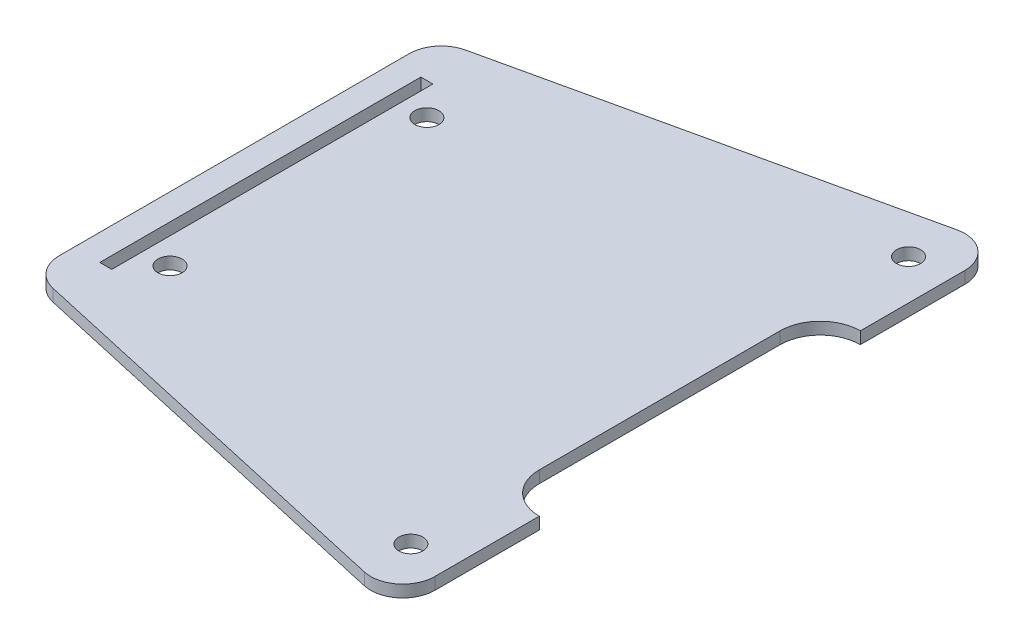
ISO-10303-21;
HEADER;
FILE_DESCRIPTION(('STEP AP214'),'2;1');
FILE_NAME('part.step','',(''),(''),'','','');
FILE_SCHEMA(('AUTOMOTIVE_DESIGN { 1 0 10303 214 1 1 1 1 }'));
ENDSEC;
DATA;
#1=APPLICATION_CONTEXT('core data for automotive mechanical design processes');
#2=APPLICATION_PROTOCOL_DEFINITION('international standard','automotive_design',2000,#1);
#3=PRODUCT_CONTEXT('',#1,'mechanical');
#4=PRODUCT('Part','Part','',(#3));
#5=PRODUCT_RELATED_PRODUCT_CATEGORY('part','',(#4));
#6=PRODUCT_DEFINITION_FORMATION('','',#4);
#7=PRODUCT_DEFINITION_CONTEXT('part definition',#1,'design');
#8=PRODUCT_DEFINITION('design','',#6,#7);
#9=PRODUCT_DEFINITION_SHAPE('','',#8);
#10=(LENGTH_UNIT() NAMED_UNIT(*) SI_UNIT(.MILLI.,.METRE.));
#11=(NAMED_UNIT(*) PLANE_ANGLE_UNIT() SI_UNIT($,.RADIAN.));
#12=(NAMED_UNIT(*) SI_UNIT($,.STERADIAN.) SOLID_ANGLE_UNIT());
#13=UNCERTAINTY_MEASURE_WITH_UNIT(LENGTH_MEASURE(1.E-05),#10,'distance_accuracy_value','');
#14=(GEOMETRIC_REPRESENTATION_CONTEXT(3) GLOBAL_UNCERTAINTY_ASSIGNED_CONTEXT((#13)) GLOBAL_UNIT_ASSIGNED_CONTEXT((#10,
#11,#12)) REPRESENTATION_CONTEXT('',''));
#15=CARTESIAN_POINT('',(0.,0.,0.));
#16=DIRECTION('',(0.,0.,1.));
#17=DIRECTION('',(1.,0.,0.));
#18=AXIS2_PLACEMENT_3D('',#15,#16,#17);
#19=CARTESIAN_POINT('',(25.,1.5,-38.));
#20=DIRECTION('',(-1.,0.,0.));
#21=DIRECTION('',(0.,0.,1.));
#22=AXIS2_PLACEMENT_3D('',#19,#20,#21);
#23=PLANE('',#22);
#24=DIRECTION('',(0.,0.,-1.));
#25=VECTOR('',#24,1.);
#26=CARTESIAN_POINT('',(25.,1.5,-38.));
#27=LINE('',#26,#25);
#28=CARTESIAN_POINT('',(25.,1.5,33.00420383401));
#29=VERTEX_POINT('',#28);
#30=CARTESIAN_POINT('',(25.,1.5,20.));
#31=VERTEX_POINT('',#30);
#32=EDGE_CURVE('E253',#29,#31,#27,.T.);
#33=ORIENTED_EDGE('',*,*,#32,.F.);
#34=DIRECTION('',(0.,-1.,0.));
#35=VECTOR('',#34,1.);
#36=CARTESIAN_POINT('',(25.,1.5,33.00420383401));
#37=LINE('',#36,#35);
#38=CARTESIAN_POINT('',(25.,0.,33.00420383401));
#39=VERTEX_POINT('',#38);
#40=EDGE_CURVE('E293',#29,#39,#37,.T.);
#41=ORIENTED_EDGE('',*,*,#40,.T.);
#42=DIRECTION('',(0.,0.,-1.));
#43=VECTOR('',#42,1.);
#44=CARTESIAN_POINT('',(25.,0.,-38.));
#45=LINE('',#44,#43);
#46=CARTESIAN_POINT('',(25.,0.,20.));
#47=VERTEX_POINT('',#46);
#48=EDGE_CURVE('E246',#39,#47,#45,.T.);
#49=ORIENTED_EDGE('',*,*,#48,.T.);
#50=DIRECTION('',(0.,1.,0.));
#51=VECTOR('',#50,1.);
#52=CARTESIAN_POINT('',(25.,0.,20.));
#53=LINE('',#52,#51);
#54=EDGE_CURVE('E265',#47,#31,#53,.T.);
#55=ORIENTED_EDGE('',*,*,#54,.T.);
#56=EDGE_LOOP('',(#33,#41,#49,#55));
#57=FACE_BOUND('',#56,.T.);
#58=ADVANCED_FACE('F37',(#57),#23,.F.);
#59=CARTESIAN_POINT('',(0.,1.5,0.));
#60=DIRECTION('',(0.,-1.,0.));
#61=DIRECTION('',(0.,0.,-1.));
#62=AXIS2_PLACEMENT_3D('',#59,#60,#61);
#63=PLANE('',#62);
#64=CARTESIAN_POINT('',(-25.0000000000001,1.5,16.));
#65=DIRECTION('',(0.,1.,0.));
#66=DIRECTION('',(0.,0.,-1.));
#67=AXIS2_PLACEMENT_3D('',#64,#65,#66);
#68=CIRCLE('',#67,1.5);
#69=CARTESIAN_POINT('',(-25.0000000000001,1.5,14.5));
#70=VERTEX_POINT('',#69);
#71=EDGE_CURVE('E219',#70,#70,#68,.T.);
#72=ORIENTED_EDGE('',*,*,#71,.F.);
#73=EDGE_LOOP('',(#72));
#74=FACE_BOUND('',#73,.T.);
#75=CARTESIAN_POINT('',(20.,1.5,31.));
#76=DIRECTION('',(0.,1.,0.));
#77=DIRECTION('',(0.,0.,-1.));
#78=AXIS2_PLACEMENT_3D('',#75,#76,#77);
#79=CIRCLE('',#78,1.5);
#80=CARTESIAN_POINT('',(20.,1.5,29.5));
#81=VERTEX_POINT('',#80);
#82=EDGE_CURVE('E225',#81,#81,#79,.T.);
#83=ORIENTED_EDGE('',*,*,#82,.F.);
#84=EDGE_LOOP('',(#83));
#85=FACE_BOUND('',#84,.T.);
#86=CARTESIAN_POINT('',(20.,1.5,-31.));
#87=DIRECTION('',(0.,1.,0.));
#88=DIRECTION('',(0.,0.,1.));
#89=AXIS2_PLACEMENT_3D('',#86,#87,#88);
#90=CIRCLE('',#89,1.5);
#91=CARTESIAN_POINT('',(20.,1.5,-29.5));
#92=VERTEX_POINT('',#91);
#93=EDGE_CURVE('E231',#92,#92,#90,.T.);
#94=ORIENTED_EDGE('',*,*,#93,.F.);
#95=EDGE_LOOP('',(#94));
#96=FACE_BOUND('',#95,.T.);
#97=CARTESIAN_POINT('',(-25.0000000000001,1.5,-16.));
#98=DIRECTION('',(0.,1.,0.));
#99=DIRECTION('',(0.,0.,1.));
#100=AXIS2_PLACEMENT_3D('',#97,#98,#99);
#101=CIRCLE('',#100,1.5);
#102=CARTESIAN_POINT('',(-25.0000000000001,1.5,-14.5));
#103=VERTEX_POINT('',#102);
#104=EDGE_CURVE('E237',#103,#103,#101,.T.);
#105=ORIENTED_EDGE('',*,*,#104,.F.);
#106=EDGE_LOOP('',(#105));
#107=FACE_BOUND('',#106,.T.);
#108=DIRECTION('',(0.,0.,1.));
#109=VECTOR('',#108,1.);
#110=CARTESIAN_POINT('',(-33.,1.5,-25.));
#111=LINE('',#110,#109);
#112=CARTESIAN_POINT('',(-33.,1.5,-21.7973072822859));
#113=VERTEX_POINT('',#112);
#114=CARTESIAN_POINT('',(-33.,1.5,21.7973072822859));
#115=VERTEX_POINT('',#114);
#116=EDGE_CURVE('E245',#113,#115,#111,.T.);
#117=ORIENTED_EDGE('',*,*,#116,.T.);
#118=CARTESIAN_POINT('',(-29.,1.5,21.7973072822859));
#119=DIRECTION('',(0.,-1.,0.));
#120=DIRECTION('',(0.,0.,-1.));
#121=AXIS2_PLACEMENT_3D('',#118,#119,#120);
#122=CIRCLE('',#121,4.);
#123=CARTESIAN_POINT('',(-29.8748458276695,1.5,25.7004655903499));
#124=VERTEX_POINT('',#123);
#125=EDGE_CURVE('E291',#115,#124,#122,.F.);
#126=ORIENTED_EDGE('',*,*,#125,.T.);
#127=DIRECTION('',(0.975789577016006,0.,0.218711456917381));
#128=VECTOR('',#127,1.);
#129=CARTESIAN_POINT('',(25.,1.5,38.));
#130=LINE('',#129,#128);
#131=CARTESIAN_POINT('',(20.1251541723305,1.5,36.9073621420741));
#132=VERTEX_POINT('',#131);
#133=EDGE_CURVE('E249',#124,#132,#130,.T.);
#134=ORIENTED_EDGE('',*,*,#133,.T.);
#135=CARTESIAN_POINT('',(21.,1.5,33.00420383401));
#136=DIRECTION('',(0.,-1.,0.));
#137=DIRECTION('',(0.,0.,-1.));
#138=AXIS2_PLACEMENT_3D('',#135,#136,#137);
#139=CIRCLE('',#138,4.);
#140=EDGE_CURVE('E289',#132,#29,#139,.F.);
#141=ORIENTED_EDGE('',*,*,#140,.T.);
#142=ORIENTED_EDGE('',*,*,#32,.T.);
#143=CARTESIAN_POINT('',(25.,1.5,15.));
#144=DIRECTION('',(0.,1.,0.));
#145=DIRECTION('',(0.,0.,1.));
#146=AXIS2_PLACEMENT_3D('',#143,#144,#145);
#147=CIRCLE('',#146,5.);
#148=CARTESIAN_POINT('',(20.,1.5,15.));
#149=VERTEX_POINT('',#148);
#150=EDGE_CURVE('E181',#149,#31,#147,.T.);
#151=ORIENTED_EDGE('',*,*,#150,.F.);
#152=DIRECTION('',(0.,0.,1.));
#153=VECTOR('',#152,1.);
#154=CARTESIAN_POINT('',(20.,1.5,15.));
#155=LINE('',#154,#153);
#156=CARTESIAN_POINT('',(20.,1.5,-15.));
#157=VERTEX_POINT('',#156);
#158=EDGE_CURVE('E178',#157,#149,#155,.T.);
#159=ORIENTED_EDGE('',*,*,#158,.F.);
#160=CARTESIAN_POINT('',(25.,1.5,-15.));
#161=DIRECTION('',(0.,1.,0.));
#162=DIRECTION('',(0.,0.,1.));
#163=AXIS2_PLACEMENT_3D('',#160,#161,#162);
#164=CIRCLE('',#163,5.);
#165=CARTESIAN_POINT('',(25.,1.5,-20.));
#166=VERTEX_POINT('',#165);
#167=EDGE_CURVE('E157',#166,#157,#164,.T.);
#168=ORIENTED_EDGE('',*,*,#167,.F.);
#169=CARTESIAN_POINT('',(25.,1.5,-33.00420383401));
#170=VERTEX_POINT('',#169);
#171=EDGE_CURVE('E252',#166,#170,#27,.T.);
#172=ORIENTED_EDGE('',*,*,#171,.T.);
#173=CARTESIAN_POINT('',(21.,1.5,-33.00420383401));
#174=DIRECTION('',(0.,-1.,0.));
#175=DIRECTION('',(0.,0.,-1.));
#176=AXIS2_PLACEMENT_3D('',#173,#174,#175);
#177=CIRCLE('',#176,4.);
#178=CARTESIAN_POINT('',(20.1251541723305,1.5,-36.9073621420741));
#179=VERTEX_POINT('',#178);
#180=EDGE_CURVE('E59',#170,#179,#177,.F.);
#181=ORIENTED_EDGE('',*,*,#180,.T.);
#182=DIRECTION('',(-0.975789577016006,0.,0.218711456917381));
#183=VECTOR('',#182,1.);
#184=CARTESIAN_POINT('',(-33.,1.5,-25.));
#185=LINE('',#184,#183);
#186=CARTESIAN_POINT('',(-29.8748458276695,1.5,-25.7004655903499));
#187=VERTEX_POINT('',#186);
#188=EDGE_CURVE('E243',#179,#187,#185,.T.);
#189=ORIENTED_EDGE('',*,*,#188,.T.);
#190=CARTESIAN_POINT('',(-29.,1.5,-21.7973072822859));
#191=DIRECTION('',(0.,-1.,0.));
#192=DIRECTION('',(0.,0.,-1.));
#193=AXIS2_PLACEMENT_3D('',#190,#191,#192);
#194=CIRCLE('',#193,4.);
#195=EDGE_CURVE('E286',#187,#113,#194,.F.);
#196=ORIENTED_EDGE('',*,*,#195,.T.);
#197=EDGE_LOOP('',(#117,#126,#134,#141,#142,#151,#159,#168,#172,#181,#189,#196));
#198=FACE_BOUND('',#197,.T.);
#199=DIRECTION('',(0.,0.,-1.));
#200=VECTOR('',#199,1.);
#201=CARTESIAN_POINT('',(-28.2500000000001,1.5,19.9999999999999));
#202=LINE('',#201,#200);
#203=CARTESIAN_POINT('',(-28.2500000000001,1.5,19.9999999999999));
#204=VERTEX_POINT('',#203);
#205=CARTESIAN_POINT('',(-28.2500000000001,1.5,-20.0000000000001));
#206=VERTEX_POINT('',#205);
#207=EDGE_CURVE('E188',#204,#206,#202,.T.);
#208=ORIENTED_EDGE('',*,*,#207,.F.);
#209=DIRECTION('',(1.,0.,0.));
#210=VECTOR('',#209,1.);
#211=CARTESIAN_POINT('',(-29.7500000000001,1.5,19.9999999999999));
#212=LINE('',#211,#210);
#213=CARTESIAN_POINT('',(-29.7500000000001,1.5,19.9999999999999));
#214=VERTEX_POINT('',#213);
#215=EDGE_CURVE('E196',#214,#204,#212,.T.);
#216=ORIENTED_EDGE('',*,*,#215,.F.);
#217=DIRECTION('',(0.,0.,1.));
#218=VECTOR('',#217,1.);
#219=CARTESIAN_POINT('',(-29.7500000000001,1.5,19.9999999999999));
#220=LINE('',#219,#218);
#221=CARTESIAN_POINT('',(-29.7500000000001,1.5,-20.0000000000001));
#222=VERTEX_POINT('',#221);
#223=EDGE_CURVE('E193',#222,#214,#220,.T.);
#224=ORIENTED_EDGE('',*,*,#223,.F.);
#225=DIRECTION('',(-1.,0.,0.));
#226=VECTOR('',#225,1.);
#227=CARTESIAN_POINT('',(-29.7500000000001,1.5,-20.0000000000001));
#228=LINE('',#227,#226);
#229=EDGE_CURVE('E190',#206,#222,#228,.T.);
#230=ORIENTED_EDGE('',*,*,#229,.F.);
#231=EDGE_LOOP('',(#208,#216,#224,#230));
#232=FACE_BOUND('',#231,.T.);
#233=ADVANCED_FACE('F310',(#74,#85,#96,#107,#198,#232),#63,.F.);
#234=CARTESIAN_POINT('',(0.,0.,0.));
#235=DIRECTION('',(0.,-1.,0.));
#236=DIRECTION('',(0.,0.,-1.));
#237=AXIS2_PLACEMENT_3D('',#234,#235,#236);
#238=PLANE('',#237);
#239=DIRECTION('',(0.975789577016006,0.,0.218711456917381));
#240=VECTOR('',#239,1.);
#241=CARTESIAN_POINT('',(25.,0.,38.));
#242=LINE('',#241,#240);
#243=CARTESIAN_POINT('',(-29.8748458276695,0.,25.7004655903499));
#244=VERTEX_POINT('',#243);
#245=CARTESIAN_POINT('',(20.1251541723305,0.,36.9073621420741));
#246=VERTEX_POINT('',#245);
#247=EDGE_CURVE('E260',#244,#246,#242,.T.);
#248=ORIENTED_EDGE('',*,*,#247,.F.);
#249=CARTESIAN_POINT('',(-29.,0.,21.7973072822859));
#250=DIRECTION('',(0.,-1.,0.));
#251=DIRECTION('',(0.,0.,-1.));
#252=AXIS2_PLACEMENT_3D('',#249,#250,#251);
#253=CIRCLE('',#252,4.);
#254=CARTESIAN_POINT('',(-33.,0.,21.7973072822859));
#255=VERTEX_POINT('',#254);
#256=EDGE_CURVE('E279',#244,#255,#253,.T.);
#257=ORIENTED_EDGE('',*,*,#256,.T.);
#258=DIRECTION('',(0.,0.,1.));
#259=VECTOR('',#258,1.);
#260=CARTESIAN_POINT('',(-33.,0.,-25.));
#261=LINE('',#260,#259);
#262=CARTESIAN_POINT('',(-33.,0.,-21.7973072822859));
#263=VERTEX_POINT('',#262);
#264=EDGE_CURVE('E257',#263,#255,#261,.T.);
#265=ORIENTED_EDGE('',*,*,#264,.F.);
#266=CARTESIAN_POINT('',(-29.,0.,-21.7973072822859));
#267=DIRECTION('',(0.,-1.,0.));
#268=DIRECTION('',(0.,0.,-1.));
#269=AXIS2_PLACEMENT_3D('',#266,#267,#268);
#270=CIRCLE('',#269,4.);
#271=CARTESIAN_POINT('',(-29.8748458276695,0.,-25.7004655903499));
#272=VERTEX_POINT('',#271);
#273=EDGE_CURVE('E273',#263,#272,#270,.T.);
#274=ORIENTED_EDGE('',*,*,#273,.T.);
#275=DIRECTION('',(-0.975789577016006,0.,0.218711456917381));
#276=VECTOR('',#275,1.);
#277=CARTESIAN_POINT('',(-33.,0.,-25.));
#278=LINE('',#277,#276);
#279=CARTESIAN_POINT('',(20.1251541723305,0.,-36.9073621420741));
#280=VERTEX_POINT('',#279);
#281=EDGE_CURVE('E240',#280,#272,#278,.T.);
#282=ORIENTED_EDGE('',*,*,#281,.F.);
#283=CARTESIAN_POINT('',(21.,0.,-33.00420383401));
#284=DIRECTION('',(0.,-1.,0.));
#285=DIRECTION('',(0.,0.,-1.));
#286=AXIS2_PLACEMENT_3D('',#283,#284,#285);
#287=CIRCLE('',#286,4.);
#288=CARTESIAN_POINT('',(25.,0.,-33.00420383401));
#289=VERTEX_POINT('',#288);
#290=EDGE_CURVE('E275',#280,#289,#287,.T.);
#291=ORIENTED_EDGE('',*,*,#290,.T.);
#292=CARTESIAN_POINT('',(25.,0.,-20.));
#293=VERTEX_POINT('',#292);
#294=EDGE_CURVE('E175',#293,#289,#45,.T.);
#295=ORIENTED_EDGE('',*,*,#294,.F.);
#296=CARTESIAN_POINT('',(25.,0.,-15.));
#297=DIRECTION('',(0.,1.,0.));
#298=DIRECTION('',(0.,0.,1.));
#299=AXIS2_PLACEMENT_3D('',#296,#297,#298);
#300=CIRCLE('',#299,5.);
#301=CARTESIAN_POINT('',(20.,0.,-15.));
#302=VERTEX_POINT('',#301);
#303=EDGE_CURVE('E154',#293,#302,#300,.T.);
#304=ORIENTED_EDGE('',*,*,#303,.T.);
#305=DIRECTION('',(0.,0.,1.));
#306=VECTOR('',#305,1.);
#307=CARTESIAN_POINT('',(20.,0.,15.));
#308=LINE('',#307,#306);
#309=CARTESIAN_POINT('',(20.,0.,15.));
#310=VERTEX_POINT('',#309);
#311=EDGE_CURVE('E162',#302,#310,#308,.T.);
#312=ORIENTED_EDGE('',*,*,#311,.T.);
#313=CARTESIAN_POINT('',(25.,0.,15.));
#314=DIRECTION('',(0.,1.,0.));
#315=DIRECTION('',(0.,0.,1.));
#316=AXIS2_PLACEMENT_3D('',#313,#314,#315);
#317=CIRCLE('',#316,5.);
#318=EDGE_CURVE('E176',#310,#47,#317,.T.);
#319=ORIENTED_EDGE('',*,*,#318,.T.);
#320=ORIENTED_EDGE('',*,*,#48,.F.);
#321=CARTESIAN_POINT('',(21.,0.,33.00420383401));
#322=DIRECTION('',(0.,-1.,0.));
#323=DIRECTION('',(0.,0.,-1.));
#324=AXIS2_PLACEMENT_3D('',#321,#322,#323);
#325=CIRCLE('',#324,4.);
#326=EDGE_CURVE('E277',#39,#246,#325,.T.);
#327=ORIENTED_EDGE('',*,*,#326,.T.);
#328=EDGE_LOOP('',(#248,#257,#265,#274,#282,#291,#295,#304,#312,#319,#320,#327));
#329=FACE_BOUND('',#328,.T.);
#330=CARTESIAN_POINT('',(20.,0.,31.));
#331=DIRECTION('',(0.,1.,0.));
#332=DIRECTION('',(0.,0.,-1.));
#333=AXIS2_PLACEMENT_3D('',#330,#331,#332);
#334=CIRCLE('',#333,1.5);
#335=CARTESIAN_POINT('',(20.,0.,29.5));
#336=VERTEX_POINT('',#335);
#337=EDGE_CURVE('E222',#336,#336,#334,.T.);
#338=ORIENTED_EDGE('',*,*,#337,.T.);
#339=EDGE_LOOP('',(#338));
#340=FACE_BOUND('',#339,.T.);
#341=CARTESIAN_POINT('',(-25.0000000000001,0.,-16.));
#342=DIRECTION('',(0.,1.,0.));
#343=DIRECTION('',(0.,0.,1.));
#344=AXIS2_PLACEMENT_3D('',#341,#342,#343);
#345=CIRCLE('',#344,1.5);
#346=CARTESIAN_POINT('',(-25.0000000000001,0.,-14.5));
#347=VERTEX_POINT('',#346);
#348=EDGE_CURVE('E234',#347,#347,#345,.T.);
#349=ORIENTED_EDGE('',*,*,#348,.T.);
#350=EDGE_LOOP('',(#349));
#351=FACE_BOUND('',#350,.T.);
#352=CARTESIAN_POINT('',(20.,0.,-31.));
#353=DIRECTION('',(0.,1.,0.));
#354=DIRECTION('',(0.,0.,1.));
#355=AXIS2_PLACEMENT_3D('',#352,#353,#354);
#356=CIRCLE('',#355,1.5);
#357=CARTESIAN_POINT('',(20.,0.,-29.5));
#358=VERTEX_POINT('',#357);
#359=EDGE_CURVE('E228',#358,#358,#356,.T.);
#360=ORIENTED_EDGE('',*,*,#359,.T.);
#361=EDGE_LOOP('',(#360));
#362=FACE_BOUND('',#361,.T.);
#363=CARTESIAN_POINT('',(-25.0000000000001,0.,16.));
#364=DIRECTION('',(0.,1.,0.));
#365=DIRECTION('',(0.,0.,-1.));
#366=AXIS2_PLACEMENT_3D('',#363,#364,#365);
#367=CIRCLE('',#366,1.5);
#368=CARTESIAN_POINT('',(-25.0000000000001,0.,14.5));
#369=VERTEX_POINT('',#368);
#370=EDGE_CURVE('E218',#369,#369,#367,.T.);
#371=ORIENTED_EDGE('',*,*,#370,.T.);
#372=EDGE_LOOP('',(#371));
#373=FACE_BOUND('',#372,.T.);
#374=DIRECTION('',(1.,0.,0.));
#375=VECTOR('',#374,1.);
#376=CARTESIAN_POINT('',(-29.7500000000001,0.,19.9999999999999));
#377=LINE('',#376,#375);
#378=CARTESIAN_POINT('',(-29.7500000000001,0.,19.9999999999999));
#379=VERTEX_POINT('',#378);
#380=CARTESIAN_POINT('',(-28.2500000000001,0.,19.9999999999999));
#381=VERTEX_POINT('',#380);
#382=EDGE_CURVE('E191',#379,#381,#377,.T.);
#383=ORIENTED_EDGE('',*,*,#382,.T.);
#384=DIRECTION('',(0.,0.,-1.));
#385=VECTOR('',#384,1.);
#386=CARTESIAN_POINT('',(-28.2500000000001,0.,19.9999999999999));
#387=LINE('',#386,#385);
#388=CARTESIAN_POINT('',(-28.2500000000001,0.,-20.0000000000001));
#389=VERTEX_POINT('',#388);
#390=EDGE_CURVE('E186',#381,#389,#387,.T.);
#391=ORIENTED_EDGE('',*,*,#390,.T.);
#392=DIRECTION('',(-1.,0.,0.));
#393=VECTOR('',#392,1.);
#394=CARTESIAN_POINT('',(-29.7500000000001,0.,-20.0000000000001));
#395=LINE('',#394,#393);
#396=CARTESIAN_POINT('',(-29.7500000000001,0.,-20.0000000000001));
#397=VERTEX_POINT('',#396);
#398=EDGE_CURVE('E201',#389,#397,#395,.T.);
#399=ORIENTED_EDGE('',*,*,#398,.T.);
#400=DIRECTION('',(0.,0.,1.));
#401=VECTOR('',#400,1.);
#402=CARTESIAN_POINT('',(-29.7500000000001,0.,19.9999999999999));
#403=LINE('',#402,#401);
#404=EDGE_CURVE('E204',#397,#379,#403,.T.);
#405=ORIENTED_EDGE('',*,*,#404,.T.);
#406=EDGE_LOOP('',(#383,#391,#399,#405));
#407=FACE_BOUND('',#406,.T.);
#408=ADVANCED_FACE('F172',(#329,#340,#351,#362,#373,#407),#238,.T.);
#409=CARTESIAN_POINT('',(-33.,1.5,-25.));
#410=DIRECTION('',(0.218711456917381,0.,0.975789577016006));
#411=DIRECTION('',(0.975789577016006,0.,-0.218711456917381));
#412=AXIS2_PLACEMENT_3D('',#409,#410,#411);
#413=PLANE('',#412);
#414=ORIENTED_EDGE('',*,*,#188,.F.);
#415=DIRECTION('',(0.,-1.,0.));
#416=VECTOR('',#415,1.);
#417=CARTESIAN_POINT('',(20.1251541723305,1.5,-36.9073621420741));
#418=LINE('',#417,#416);
#419=EDGE_CURVE('E45',#179,#280,#418,.T.);
#420=ORIENTED_EDGE('',*,*,#419,.T.);
#421=ORIENTED_EDGE('',*,*,#281,.T.);
#422=DIRECTION('',(0.,-1.,0.));
#423=VECTOR('',#422,1.);
#424=CARTESIAN_POINT('',(-29.8748458276695,1.5,-25.7004655903499));
#425=LINE('',#424,#423);
#426=EDGE_CURVE('E52',#272,#187,#425,.F.);
#427=ORIENTED_EDGE('',*,*,#426,.T.);
#428=EDGE_LOOP('',(#414,#420,#421,#427));
#429=FACE_BOUND('',#428,.T.);
#430=ADVANCED_FACE('F299',(#429),#413,.F.);
#431=CARTESIAN_POINT('',(-33.,1.5,-25.));
#432=DIRECTION('',(1.,0.,0.));
#433=DIRECTION('',(0.,0.,-1.));
#434=AXIS2_PLACEMENT_3D('',#431,#432,#433);
#435=PLANE('',#434);
#436=ORIENTED_EDGE('',*,*,#264,.T.);
#437=DIRECTION('',(0.,-1.,0.));
#438=VECTOR('',#437,1.);
#439=CARTESIAN_POINT('',(-33.,1.5,21.7973072822859));
#440=LINE('',#439,#438);
#441=EDGE_CURVE('E284',#255,#115,#440,.F.);
#442=ORIENTED_EDGE('',*,*,#441,.T.);
#443=ORIENTED_EDGE('',*,*,#116,.F.);
#444=DIRECTION('',(0.,-1.,0.));
#445=VECTOR('',#444,1.);
#446=CARTESIAN_POINT('',(-33.,1.5,-21.7973072822859));
#447=LINE('',#446,#445);
#448=EDGE_CURVE('E281',#113,#263,#447,.T.);
#449=ORIENTED_EDGE('',*,*,#448,.T.);
#450=EDGE_LOOP('',(#436,#442,#443,#449));
#451=FACE_BOUND('',#450,.T.);
#452=ADVANCED_FACE('F307',(#451),#435,.F.);
#453=CARTESIAN_POINT('',(25.,1.5,38.));
#454=DIRECTION('',(0.218711456917381,0.,-0.975789577016006));
#455=DIRECTION('',(-0.975789577016007,0.,-0.218711456917381));
#456=AXIS2_PLACEMENT_3D('',#453,#454,#455);
#457=PLANE('',#456);
#458=ORIENTED_EDGE('',*,*,#133,.F.);
#459=DIRECTION('',(0.,-1.,0.));
#460=VECTOR('',#459,1.);
#461=CARTESIAN_POINT('',(-29.8748458276695,1.5,25.7004655903499));
#462=LINE('',#461,#460);
#463=EDGE_CURVE('E270',#124,#244,#462,.T.);
#464=ORIENTED_EDGE('',*,*,#463,.T.);
#465=ORIENTED_EDGE('',*,*,#247,.T.);
#466=DIRECTION('',(0.,-1.,0.));
#467=VECTOR('',#466,1.);
#468=CARTESIAN_POINT('',(20.1251541723305,1.5,36.9073621420741));
#469=LINE('',#468,#467);
#470=EDGE_CURVE('E268',#246,#132,#469,.F.);
#471=ORIENTED_EDGE('',*,*,#470,.T.);
#472=EDGE_LOOP('',(#458,#464,#465,#471));
#473=FACE_BOUND('',#472,.T.);
#474=ADVANCED_FACE('F317',(#473),#457,.F.);
#475=ORIENTED_EDGE('',*,*,#294,.T.);
#476=DIRECTION('',(0.,-1.,0.));
#477=VECTOR('',#476,1.);
#478=CARTESIAN_POINT('',(25.,1.5,-33.00420383401));
#479=LINE('',#478,#477);
#480=EDGE_CURVE('E11',#289,#170,#479,.F.);
#481=ORIENTED_EDGE('',*,*,#480,.T.);
#482=ORIENTED_EDGE('',*,*,#171,.F.);
#483=DIRECTION('',(0.,1.,0.));
#484=VECTOR('',#483,1.);
#485=CARTESIAN_POINT('',(25.,0.,-20.));
#486=LINE('',#485,#484);
#487=EDGE_CURVE('E255',#166,#293,#486,.F.);
#488=ORIENTED_EDGE('',*,*,#487,.T.);
#489=EDGE_LOOP('',(#475,#481,#482,#488));
#490=FACE_BOUND('',#489,.T.);
#491=ADVANCED_FACE('F332',(#490),#23,.F.);
#492=CARTESIAN_POINT('',(-25.0000000000001,1.5,-16.));
#493=DIRECTION('',(0.,-1.,0.));
#494=DIRECTION('',(0.,0.,-1.));
#495=AXIS2_PLACEMENT_3D('',#492,#493,#494);
#496=CYLINDRICAL_SURFACE('',#495,1.5);
#497=ORIENTED_EDGE('',*,*,#104,.T.);
#498=EDGE_LOOP('',(#497));
#499=FACE_BOUND('',#498,.T.);
#500=ORIENTED_EDGE('',*,*,#348,.F.);
#501=EDGE_LOOP('',(#500));
#502=FACE_BOUND('',#501,.T.);
#503=ADVANCED_FACE('F351',(#499,#502),#496,.F.);
#504=CARTESIAN_POINT('',(20.,1.5,-31.));
#505=DIRECTION('',(0.,-1.,0.));
#506=DIRECTION('',(0.,0.,-1.));
#507=AXIS2_PLACEMENT_3D('',#504,#505,#506);
#508=CYLINDRICAL_SURFACE('',#507,1.5);
#509=ORIENTED_EDGE('',*,*,#93,.T.);
#510=EDGE_LOOP('',(#509));
#511=FACE_BOUND('',#510,.T.);
#512=ORIENTED_EDGE('',*,*,#359,.F.);
#513=EDGE_LOOP('',(#512));
#514=FACE_BOUND('',#513,.T.);
#515=ADVANCED_FACE('F356',(#511,#514),#508,.F.);
#516=CARTESIAN_POINT('',(20.,1.5,31.));
#517=DIRECTION('',(0.,-1.,0.));
#518=DIRECTION('',(0.,0.,-1.));
#519=AXIS2_PLACEMENT_3D('',#516,#517,#518);
#520=CYLINDRICAL_SURFACE('',#519,1.5);
#521=ORIENTED_EDGE('',*,*,#82,.T.);
#522=EDGE_LOOP('',(#521));
#523=FACE_BOUND('',#522,.T.);
#524=ORIENTED_EDGE('',*,*,#337,.F.);
#525=EDGE_LOOP('',(#524));
#526=FACE_BOUND('',#525,.T.);
#527=ADVANCED_FACE('F397',(#523,#526),#520,.F.);
#528=CARTESIAN_POINT('',(-25.0000000000001,1.5,16.));
#529=DIRECTION('',(0.,-1.,0.));
#530=DIRECTION('',(0.,0.,-1.));
#531=AXIS2_PLACEMENT_3D('',#528,#529,#530);
#532=CYLINDRICAL_SURFACE('',#531,1.5);
#533=ORIENTED_EDGE('',*,*,#71,.T.);
#534=EDGE_LOOP('',(#533));
#535=FACE_BOUND('',#534,.T.);
#536=ORIENTED_EDGE('',*,*,#370,.F.);
#537=EDGE_LOOP('',(#536));
#538=FACE_BOUND('',#537,.T.);
#539=ADVANCED_FACE('F393',(#535,#538),#532,.F.);
#540=CARTESIAN_POINT('',(-28.2500000000001,1.5,19.9999999999999));
#541=DIRECTION('',(-1.,0.,0.));
#542=DIRECTION('',(0.,0.,1.));
#543=AXIS2_PLACEMENT_3D('',#540,#541,#542);
#544=PLANE('',#543);
#545=ORIENTED_EDGE('',*,*,#390,.F.);
#546=DIRECTION('',(0.,-1.,0.));
#547=VECTOR('',#546,1.);
#548=CARTESIAN_POINT('',(-28.2500000000001,1.5,19.9999999999999));
#549=LINE('',#548,#547);
#550=EDGE_CURVE('E198',#204,#381,#549,.T.);
#551=ORIENTED_EDGE('',*,*,#550,.F.);
#552=ORIENTED_EDGE('',*,*,#207,.T.);
#553=DIRECTION('',(0.,-1.,0.));
#554=VECTOR('',#553,1.);
#555=CARTESIAN_POINT('',(-28.2500000000001,1.5,-20.0000000000001));
#556=LINE('',#555,#554);
#557=EDGE_CURVE('E215',#206,#389,#556,.T.);
#558=ORIENTED_EDGE('',*,*,#557,.T.);
#559=EDGE_LOOP('',(#545,#551,#552,#558));
#560=FACE_BOUND('',#559,.T.);
#561=ADVANCED_FACE('F389',(#560),#544,.T.);
#562=CARTESIAN_POINT('',(-29.7500000000001,1.5,-20.0000000000001));
#563=DIRECTION('',(0.,0.,1.));
#564=DIRECTION('',(1.,0.,0.));
#565=AXIS2_PLACEMENT_3D('',#562,#563,#564);
#566=PLANE('',#565);
#567=ORIENTED_EDGE('',*,*,#398,.F.);
#568=ORIENTED_EDGE('',*,*,#557,.F.);
#569=ORIENTED_EDGE('',*,*,#229,.T.);
#570=DIRECTION('',(0.,-1.,0.));
#571=VECTOR('',#570,1.);
#572=CARTESIAN_POINT('',(-29.7500000000001,1.5,-20.0000000000001));
#573=LINE('',#572,#571);
#574=EDGE_CURVE('E213',#222,#397,#573,.T.);
#575=ORIENTED_EDGE('',*,*,#574,.T.);
#576=EDGE_LOOP('',(#567,#568,#569,#575));
#577=FACE_BOUND('',#576,.T.);
#578=ADVANCED_FACE('F385',(#577),#566,.T.);
#579=CARTESIAN_POINT('',(-29.7500000000001,1.5,19.9999999999999));
#580=DIRECTION('',(1.,0.,0.));
#581=DIRECTION('',(0.,0.,-1.));
#582=AXIS2_PLACEMENT_3D('',#579,#580,#581);
#583=PLANE('',#582);
#584=ORIENTED_EDGE('',*,*,#404,.F.);
#585=ORIENTED_EDGE('',*,*,#574,.F.);
#586=ORIENTED_EDGE('',*,*,#223,.T.);
#587=DIRECTION('',(0.,-1.,0.));
#588=VECTOR('',#587,1.);
#589=CARTESIAN_POINT('',(-29.7500000000001,1.5,19.9999999999999));
#590=LINE('',#589,#588);
#591=EDGE_CURVE('E211',#214,#379,#590,.T.);
#592=ORIENTED_EDGE('',*,*,#591,.T.);
#593=EDGE_LOOP('',(#584,#585,#586,#592));
#594=FACE_BOUND('',#593,.T.);
#595=ADVANCED_FACE('F381',(#594),#583,.T.);
#596=CARTESIAN_POINT('',(-29.7500000000001,1.5,19.9999999999999));
#597=DIRECTION('',(0.,0.,-1.));
#598=DIRECTION('',(-1.,0.,0.));
#599=AXIS2_PLACEMENT_3D('',#596,#597,#598);
#600=PLANE('',#599);
#601=ORIENTED_EDGE('',*,*,#382,.F.);
#602=ORIENTED_EDGE('',*,*,#591,.F.);
#603=ORIENTED_EDGE('',*,*,#215,.T.);
#604=ORIENTED_EDGE('',*,*,#550,.T.);
#605=EDGE_LOOP('',(#601,#602,#603,#604));
#606=FACE_BOUND('',#605,.T.);
#607=ADVANCED_FACE('F378',(#606),#600,.T.);
#608=CARTESIAN_POINT('',(25.,0.,15.));
#609=DIRECTION('',(0.,1.,0.));
#610=DIRECTION('',(0.,0.,1.));
#611=AXIS2_PLACEMENT_3D('',#608,#609,#610);
#612=CYLINDRICAL_SURFACE('',#611,5.);
#613=ORIENTED_EDGE('',*,*,#318,.F.);
#614=DIRECTION('',(0.,1.,0.));
#615=VECTOR('',#614,1.);
#616=CARTESIAN_POINT('',(20.,0.,15.));
#617=LINE('',#616,#615);
#618=EDGE_CURVE('E161',#310,#149,#617,.T.);
#619=ORIENTED_EDGE('',*,*,#618,.T.);
#620=ORIENTED_EDGE('',*,*,#150,.T.);
#621=ORIENTED_EDGE('',*,*,#54,.F.);
#622=EDGE_LOOP('',(#613,#619,#620,#621));
#623=FACE_BOUND('',#622,.T.);
#624=ADVANCED_FACE('F329',(#623),#612,.F.);
#625=CARTESIAN_POINT('',(25.,0.,-15.));
#626=DIRECTION('',(0.,1.,0.));
#627=DIRECTION('',(0.,0.,1.));
#628=AXIS2_PLACEMENT_3D('',#625,#626,#627);
#629=CYLINDRICAL_SURFACE('',#628,5.);
#630=ORIENTED_EDGE('',*,*,#167,.T.);
#631=DIRECTION('',(0.,1.,0.));
#632=VECTOR('',#631,1.);
#633=CARTESIAN_POINT('',(20.,0.,-15.));
#634=LINE('',#633,#632);
#635=EDGE_CURVE('E150',#302,#157,#634,.T.);
#636=ORIENTED_EDGE('',*,*,#635,.F.);
#637=ORIENTED_EDGE('',*,*,#303,.F.);
#638=ORIENTED_EDGE('',*,*,#487,.F.);
#639=EDGE_LOOP('',(#630,#636,#637,#638));
#640=FACE_BOUND('',#639,.T.);
#641=ADVANCED_FACE('F152',(#640),#629,.F.);
#642=CARTESIAN_POINT('',(20.,0.,15.));
#643=DIRECTION('',(-1.,0.,0.));
#644=DIRECTION('',(0.,0.,1.));
#645=AXIS2_PLACEMENT_3D('',#642,#643,#644);
#646=PLANE('',#645);
#647=ORIENTED_EDGE('',*,*,#158,.T.);
#648=ORIENTED_EDGE('',*,*,#618,.F.);
#649=ORIENTED_EDGE('',*,*,#311,.F.);
#650=ORIENTED_EDGE('',*,*,#635,.T.);
#651=EDGE_LOOP('',(#647,#648,#649,#650));
#652=FACE_BOUND('',#651,.T.);
#653=ADVANCED_FACE('F165',(#652),#646,.F.);
#654=CARTESIAN_POINT('',(-29.,1.5,21.7973072822859));
#655=DIRECTION('',(0.,-1.,0.));
#656=DIRECTION('',(0.,0.,-1.));
#657=AXIS2_PLACEMENT_3D('',#654,#655,#656);
#658=CYLINDRICAL_SURFACE('',#657,4.);
#659=ORIENTED_EDGE('',*,*,#125,.F.);
#660=ORIENTED_EDGE('',*,*,#441,.F.);
#661=ORIENTED_EDGE('',*,*,#256,.F.);
#662=ORIENTED_EDGE('',*,*,#463,.F.);
#663=EDGE_LOOP('',(#659,#660,#661,#662));
#664=FACE_BOUND('',#663,.T.);
#665=ADVANCED_FACE('F315',(#664),#658,.T.);
#666=CARTESIAN_POINT('',(21.,1.5,33.00420383401));
#667=DIRECTION('',(0.,-1.,0.));
#668=DIRECTION('',(0.,0.,-1.));
#669=AXIS2_PLACEMENT_3D('',#666,#667,#668);
#670=CYLINDRICAL_SURFACE('',#669,4.);
#671=ORIENTED_EDGE('',*,*,#140,.F.);
#672=ORIENTED_EDGE('',*,*,#470,.F.);
#673=ORIENTED_EDGE('',*,*,#326,.F.);
#674=ORIENTED_EDGE('',*,*,#40,.F.);
#675=EDGE_LOOP('',(#671,#672,#673,#674));
#676=FACE_BOUND('',#675,.T.);
#677=ADVANCED_FACE('F323',(#676),#670,.T.);
#678=CARTESIAN_POINT('',(21.,1.5,-33.00420383401));
#679=DIRECTION('',(0.,-1.,0.));
#680=DIRECTION('',(0.,0.,-1.));
#681=AXIS2_PLACEMENT_3D('',#678,#679,#680);
#682=CYLINDRICAL_SURFACE('',#681,4.);
#683=ORIENTED_EDGE('',*,*,#180,.F.);
#684=ORIENTED_EDGE('',*,*,#480,.F.);
#685=ORIENTED_EDGE('',*,*,#290,.F.);
#686=ORIENTED_EDGE('',*,*,#419,.F.);
#687=EDGE_LOOP('',(#683,#684,#685,#686));
#688=FACE_BOUND('',#687,.T.);
#689=ADVANCED_FACE('F334',(#688),#682,.T.);
#690=CARTESIAN_POINT('',(-29.,1.5,-21.7973072822859));
#691=DIRECTION('',(0.,-1.,0.));
#692=DIRECTION('',(0.,0.,-1.));
#693=AXIS2_PLACEMENT_3D('',#690,#691,#692);
#694=CYLINDRICAL_SURFACE('',#693,4.);
#695=ORIENTED_EDGE('',*,*,#195,.F.);
#696=ORIENTED_EDGE('',*,*,#426,.F.);
#697=ORIENTED_EDGE('',*,*,#273,.F.);
#698=ORIENTED_EDGE('',*,*,#448,.F.);
#699=EDGE_LOOP('',(#695,#696,#697,#698));
#700=FACE_BOUND('',#699,.T.);
#701=ADVANCED_FACE('F39',(#700),#694,.T.);
#702=CLOSED_SHELL('',(#58,#233,#408,#430,#452,#474,#491,#503,#515,#527,#539,#561,#578,#595,#607,
#624,#641,#653,#665,#677,#689,#701));
#703=MANIFOLD_SOLID_BREP('B2',#702);
#704=ADVANCED_BREP_SHAPE_REPRESENTATION('',(#18,#703),#14);
#705=SHAPE_DEFINITION_REPRESENTATION(#9,#704);
ENDSEC;
END-ISO-10303-21;
